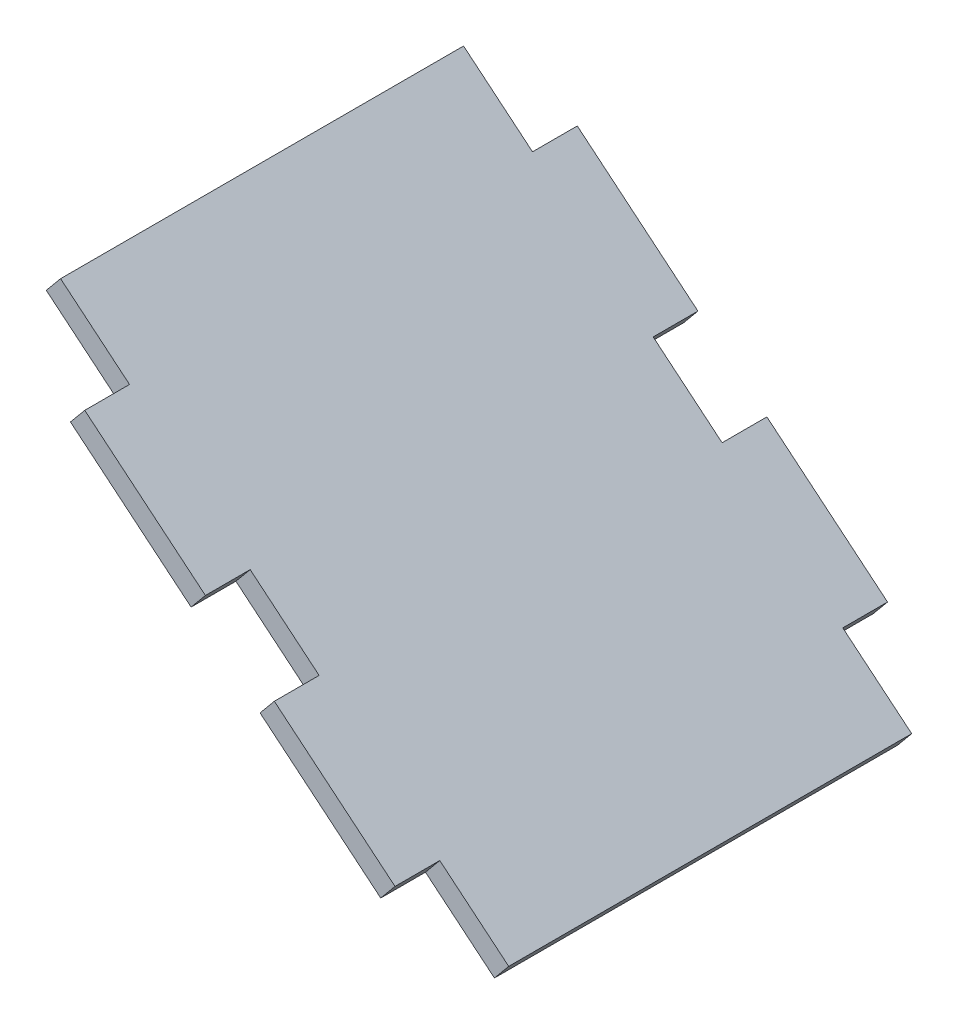
ISO-10303-21;
HEADER;
FILE_DESCRIPTION(('STEP AP214'),'2;1');
FILE_NAME('part.step','',(''),(''),'','','');
FILE_SCHEMA(('AUTOMOTIVE_DESIGN { 1 0 10303 214 1 1 1 1 }'));
ENDSEC;
DATA;
#1=APPLICATION_CONTEXT('core data for automotive mechanical design processes');
#2=APPLICATION_PROTOCOL_DEFINITION('international standard','automotive_design',2000,#1);
#3=PRODUCT_CONTEXT('',#1,'mechanical');
#4=PRODUCT('Part','Part','',(#3));
#5=PRODUCT_RELATED_PRODUCT_CATEGORY('part','',(#4));
#6=PRODUCT_DEFINITION_FORMATION('','',#4);
#7=PRODUCT_DEFINITION_CONTEXT('part definition',#1,'design');
#8=PRODUCT_DEFINITION('design','',#6,#7);
#9=PRODUCT_DEFINITION_SHAPE('','',#8);
#10=(LENGTH_UNIT() NAMED_UNIT(*) SI_UNIT(.MILLI.,.METRE.));
#11=(NAMED_UNIT(*) PLANE_ANGLE_UNIT() SI_UNIT($,.RADIAN.));
#12=(NAMED_UNIT(*) SI_UNIT($,.STERADIAN.) SOLID_ANGLE_UNIT());
#13=UNCERTAINTY_MEASURE_WITH_UNIT(LENGTH_MEASURE(1.E-05),#10,'distance_accuracy_value','');
#14=(GEOMETRIC_REPRESENTATION_CONTEXT(3) GLOBAL_UNCERTAINTY_ASSIGNED_CONTEXT((#13)) GLOBAL_UNIT_ASSIGNED_CONTEXT((#10,
#11,#12)) REPRESENTATION_CONTEXT('',''));
#15=CARTESIAN_POINT('',(0.,0.,0.));
#16=DIRECTION('',(0.,0.,1.));
#17=DIRECTION('',(1.,0.,0.));
#18=AXIS2_PLACEMENT_3D('',#15,#16,#17);
#19=CARTESIAN_POINT('',(0.,0.,0.));
#20=DIRECTION('',(0.,0.,-1.));
#21=DIRECTION('',(-1.,0.,0.));
#22=AXIS2_PLACEMENT_3D('',#19,#20,#21);
#23=PLANE('',#22);
#24=DIRECTION('',(-0.769880780139359,0.638187734426174,0.));
#25=VECTOR('',#24,1.);
#26=CARTESIAN_POINT('',(503.990679128416,281.590154943298,0.));
#27=LINE('',#26,#25);
#28=CARTESIAN_POINT('',(467.325106974279,311.983845795345,0.));
#29=VERTEX_POINT('',#28);
#30=CARTESIAN_POINT('',(450.214506635682,326.167568192966,0.));
#31=VERTEX_POINT('',#30);
#32=EDGE_CURVE('E247',#29,#31,#27,.T.);
#33=ORIENTED_EDGE('',*,*,#32,.F.);
#34=DIRECTION('',(0.638187734426175,0.769880780139357,0.));
#35=VECTOR('',#34,1.);
#36=CARTESIAN_POINT('',(123.704716452548,-102.544231220312,0.));
#37=LINE('',#36,#35);
#38=CARTESIAN_POINT('',(469.351353031082,314.428217272287,0.));
#39=VERTEX_POINT('',#38);
#40=EDGE_CURVE('E230',#29,#39,#37,.T.);
#41=ORIENTED_EDGE('',*,*,#40,.T.);
#42=DIRECTION('',(0.769880780139357,-0.638187734426175,0.));
#43=VECTOR('',#42,1.);
#44=CARTESIAN_POINT('',(442.463266784715,336.716923897121,0.));
#45=LINE('',#44,#43);
#46=CARTESIAN_POINT('',(452.240752692485,328.611939669909,0.));
#47=VERTEX_POINT('',#46);
#48=EDGE_CURVE('E243',#47,#39,#45,.T.);
#49=ORIENTED_EDGE('',*,*,#48,.F.);
#50=DIRECTION('',(-0.638187734426175,-0.769880780139357,0.));
#51=VECTOR('',#50,1.);
#52=CARTESIAN_POINT('',(106.594116113951,-88.3605088226899,0.));
#53=LINE('',#52,#51);
#54=EDGE_CURVE('E221',#47,#31,#53,.T.);
#55=ORIENTED_EDGE('',*,*,#54,.T.);
#56=EDGE_LOOP('',(#33,#41,#49,#55));
#57=FACE_BOUND('',#56,.T.);
#58=ADVANCED_FACE('F33',(#57),#23,.F.);
#59=CARTESIAN_POINT('',(0.,0.,-69.85));
#60=DIRECTION('',(0.,0.,-1.));
#61=DIRECTION('',(-1.,0.,0.));
#62=AXIS2_PLACEMENT_3D('',#59,#60,#61);
#63=PLANE('',#62);
#64=DIRECTION('',(0.638187734426175,0.769880780139357,0.));
#65=VECTOR('',#64,1.);
#66=CARTESIAN_POINT('',(123.704716452548,-102.544231220312,-69.85));
#67=LINE('',#66,#65);
#68=CARTESIAN_POINT('',(467.325106974279,311.983845795345,-69.85));
#69=VERTEX_POINT('',#68);
#70=CARTESIAN_POINT('',(469.351353031082,314.428217272287,-69.85));
#71=VERTEX_POINT('',#70);
#72=EDGE_CURVE('E211',#69,#71,#67,.T.);
#73=ORIENTED_EDGE('',*,*,#72,.F.);
#74=DIRECTION('',(-0.769880780139359,0.638187734426174,0.));
#75=VECTOR('',#74,1.);
#76=CARTESIAN_POINT('',(503.990679128416,281.590154943298,-69.85));
#77=LINE('',#76,#75);
#78=CARTESIAN_POINT('',(450.214506635682,326.167568192966,-69.85));
#79=VERTEX_POINT('',#78);
#80=EDGE_CURVE('E261',#69,#79,#77,.T.);
#81=ORIENTED_EDGE('',*,*,#80,.T.);
#82=DIRECTION('',(-0.638187734426175,-0.769880780139357,0.));
#83=VECTOR('',#82,1.);
#84=CARTESIAN_POINT('',(106.594116113951,-88.3605088226899,-69.85));
#85=LINE('',#84,#83);
#86=CARTESIAN_POINT('',(452.240752692485,328.611939669909,-69.85));
#87=VERTEX_POINT('',#86);
#88=EDGE_CURVE('E197',#87,#79,#85,.T.);
#89=ORIENTED_EDGE('',*,*,#88,.F.);
#90=DIRECTION('',(0.769880780139357,-0.638187734426175,0.));
#91=VECTOR('',#90,1.);
#92=CARTESIAN_POINT('',(442.463266784715,336.716923897121,-69.85));
#93=LINE('',#92,#91);
#94=EDGE_CURVE('E266',#87,#71,#93,.T.);
#95=ORIENTED_EDGE('',*,*,#94,.T.);
#96=EDGE_LOOP('',(#73,#81,#89,#95));
#97=FACE_BOUND('',#96,.T.);
#98=ADVANCED_FACE('F369',(#97),#63,.T.);
#99=CARTESIAN_POINT('',(440.437020727912,334.272552420179,-69.85));
#100=DIRECTION('',(0.769880780139358,-0.638187734426175,0.));
#101=DIRECTION('',(0.638187734426175,0.769880780139358,0.));
#102=AXIS2_PLACEMENT_3D('',#99,#100,#101);
#103=PLANE('',#102);
#104=DIRECTION('',(0.,0.,1.));
#105=VECTOR('',#104,1.);
#106=CARTESIAN_POINT('',(440.437020727912,334.272552420179,-69.85));
#107=LINE('',#106,#105);
#108=CARTESIAN_POINT('',(440.437020727912,334.272552420179,-63.5));
#109=VERTEX_POINT('',#108);
#110=CARTESIAN_POINT('',(440.437020727912,334.272552420179,-6.35000000000002));
#111=VERTEX_POINT('',#110);
#112=EDGE_CURVE('E199',#109,#111,#107,.T.);
#113=ORIENTED_EDGE('',*,*,#112,.T.);
#114=DIRECTION('',(0.638187734426175,0.769880780139357,0.));
#115=VECTOR('',#114,1.);
#116=CARTESIAN_POINT('',(414.5526589346,303.046830620993,-6.35000000000002));
#117=LINE('',#116,#115);
#118=CARTESIAN_POINT('',(442.463266784715,336.716923897122,-6.35000000000002));
#119=VERTEX_POINT('',#118);
#120=EDGE_CURVE('E315',#111,#119,#117,.T.);
#121=ORIENTED_EDGE('',*,*,#120,.T.);
#122=DIRECTION('',(0.,0.,1.));
#123=VECTOR('',#122,1.);
#124=CARTESIAN_POINT('',(442.463266784715,336.716923897121,-69.85));
#125=LINE('',#124,#123);
#126=CARTESIAN_POINT('',(442.463266784715,336.716923897122,-63.5));
#127=VERTEX_POINT('',#126);
#128=EDGE_CURVE('E193',#127,#119,#125,.T.);
#129=ORIENTED_EDGE('',*,*,#128,.F.);
#130=DIRECTION('',(0.638187734426175,0.769880780139357,0.));
#131=VECTOR('',#130,1.);
#132=CARTESIAN_POINT('',(414.5526589346,303.046830620993,-63.5));
#133=LINE('',#132,#131);
#134=EDGE_CURVE('E275',#109,#127,#133,.T.);
#135=ORIENTED_EDGE('',*,*,#134,.F.);
#136=EDGE_LOOP('',(#113,#121,#129,#135));
#137=FACE_BOUND('',#136,.T.);
#138=ADVANCED_FACE('F35',(#137),#103,.F.);
#139=CARTESIAN_POINT('',(442.463266784715,336.716923897121,-69.85));
#140=DIRECTION('',(-0.638187734426175,-0.769880780139357,0.));
#141=DIRECTION('',(0.769880780139357,-0.638187734426175,0.));
#142=AXIS2_PLACEMENT_3D('',#139,#140,#141);
#143=PLANE('',#142);
#144=CARTESIAN_POINT('',(479.128838938852,306.323233045075,0.));
#145=VERTEX_POINT('',#144);
#146=CARTESIAN_POINT('',(496.239439277449,292.139510647453,0.));
#147=VERTEX_POINT('',#146);
#148=EDGE_CURVE('E238',#145,#147,#45,.T.);
#149=ORIENTED_EDGE('',*,*,#148,.T.);
#150=DIRECTION('',(0.,0.,1.));
#151=VECTOR('',#150,1.);
#152=CARTESIAN_POINT('',(496.239439277449,292.139510647453,0.));
#153=LINE('',#152,#151);
#154=CARTESIAN_POINT('',(496.239439277449,292.139510647453,-6.35000000000002));
#155=VERTEX_POINT('',#154);
#156=EDGE_CURVE('E48',#155,#147,#153,.T.);
#157=ORIENTED_EDGE('',*,*,#156,.F.);
#158=DIRECTION('',(-0.769880780139358,0.638187734426174,0.));
#159=VECTOR('',#158,1.);
#160=CARTESIAN_POINT('',(506.016925185219,284.034526420241,-6.35000000000002));
#161=LINE('',#160,#159);
#162=CARTESIAN_POINT('',(506.016925185219,284.034526420241,-6.35000000000002));
#163=VERTEX_POINT('',#162);
#164=EDGE_CURVE('E176',#163,#155,#161,.T.);
#165=ORIENTED_EDGE('',*,*,#164,.F.);
#166=DIRECTION('',(0.,0.,1.));
#167=VECTOR('',#166,1.);
#168=CARTESIAN_POINT('',(506.016925185219,284.03452642024,-69.85));
#169=LINE('',#168,#167);
#170=CARTESIAN_POINT('',(506.016925185219,284.034526420241,-63.5));
#171=VERTEX_POINT('',#170);
#172=EDGE_CURVE('E188',#171,#163,#169,.T.);
#173=ORIENTED_EDGE('',*,*,#172,.F.);
#174=DIRECTION('',(0.769880780139358,-0.638187734426174,0.));
#175=VECTOR('',#174,1.);
#176=CARTESIAN_POINT('',(506.016925185219,284.034526420241,-63.5));
#177=LINE('',#176,#175);
#178=CARTESIAN_POINT('',(496.239439277449,292.139510647453,-63.5));
#179=VERTEX_POINT('',#178);
#180=EDGE_CURVE('E306',#179,#171,#177,.T.);
#181=ORIENTED_EDGE('',*,*,#180,.F.);
#182=DIRECTION('',(0.,0.,1.));
#183=VECTOR('',#182,1.);
#184=CARTESIAN_POINT('',(496.239439277449,292.139510647453,-69.85));
#185=LINE('',#184,#183);
#186=CARTESIAN_POINT('',(496.239439277449,292.139510647453,-69.85));
#187=VERTEX_POINT('',#186);
#188=EDGE_CURVE('E309',#187,#179,#185,.T.);
#189=ORIENTED_EDGE('',*,*,#188,.F.);
#190=CARTESIAN_POINT('',(479.128838938852,306.323233045075,-69.85));
#191=VERTEX_POINT('',#190);
#192=EDGE_CURVE('E255',#191,#187,#93,.T.);
#193=ORIENTED_EDGE('',*,*,#192,.F.);
#194=DIRECTION('',(0.,0.,-1.));
#195=VECTOR('',#194,1.);
#196=CARTESIAN_POINT('',(479.128838938852,306.323233045075,-69.85));
#197=LINE('',#196,#195);
#198=CARTESIAN_POINT('',(479.128838938852,306.323233045075,-63.5));
#199=VERTEX_POINT('',#198);
#200=EDGE_CURVE('E292',#199,#191,#197,.T.);
#201=ORIENTED_EDGE('',*,*,#200,.F.);
#202=DIRECTION('',(0.769880780139356,-0.638187734426177,0.));
#203=VECTOR('',#202,1.);
#204=CARTESIAN_POINT('',(469.351353031082,314.428217272287,-63.5));
#205=LINE('',#204,#203);
#206=CARTESIAN_POINT('',(469.351353031082,314.428217272287,-63.5));
#207=VERTEX_POINT('',#206);
#208=EDGE_CURVE('E295',#207,#199,#205,.T.);
#209=ORIENTED_EDGE('',*,*,#208,.F.);
#210=DIRECTION('',(0.,0.,1.));
#211=VECTOR('',#210,1.);
#212=CARTESIAN_POINT('',(469.351353031082,314.428217272287,-69.85));
#213=LINE('',#212,#211);
#214=EDGE_CURVE('E298',#71,#207,#213,.T.);
#215=ORIENTED_EDGE('',*,*,#214,.F.);
#216=ORIENTED_EDGE('',*,*,#94,.F.);
#217=DIRECTION('',(0.,0.,-1.));
#218=VECTOR('',#217,1.);
#219=CARTESIAN_POINT('',(452.240752692485,328.611939669909,-69.85));
#220=LINE('',#219,#218);
#221=CARTESIAN_POINT('',(452.240752692485,328.611939669909,-63.5));
#222=VERTEX_POINT('',#221);
#223=EDGE_CURVE('E277',#222,#87,#220,.T.);
#224=ORIENTED_EDGE('',*,*,#223,.F.);
#225=DIRECTION('',(0.769880780139356,-0.638187734426177,0.));
#226=VECTOR('',#225,1.);
#227=CARTESIAN_POINT('',(442.463266784715,336.716923897122,-63.5));
#228=LINE('',#227,#226);
#229=EDGE_CURVE('E280',#127,#222,#228,.T.);
#230=ORIENTED_EDGE('',*,*,#229,.F.);
#231=ORIENTED_EDGE('',*,*,#128,.T.);
#232=DIRECTION('',(-0.769880780139356,0.638187734426177,0.));
#233=VECTOR('',#232,1.);
#234=CARTESIAN_POINT('',(442.463266784715,336.716923897122,-6.35000000000002));
#235=LINE('',#234,#233);
#236=CARTESIAN_POINT('',(452.240752692485,328.611939669909,-6.35000000000002));
#237=VERTEX_POINT('',#236);
#238=EDGE_CURVE('E318',#237,#119,#235,.T.);
#239=ORIENTED_EDGE('',*,*,#238,.F.);
#240=DIRECTION('',(0.,0.,-1.));
#241=VECTOR('',#240,1.);
#242=CARTESIAN_POINT('',(452.240752692485,328.611939669909,0.));
#243=LINE('',#242,#241);
#244=EDGE_CURVE('E321',#47,#237,#243,.T.);
#245=ORIENTED_EDGE('',*,*,#244,.F.);
#246=ORIENTED_EDGE('',*,*,#48,.T.);
#247=DIRECTION('',(0.,0.,1.));
#248=VECTOR('',#247,1.);
#249=CARTESIAN_POINT('',(469.351353031082,314.428217272287,0.));
#250=LINE('',#249,#248);
#251=CARTESIAN_POINT('',(469.351353031082,314.428217272287,-6.35000000000002));
#252=VERTEX_POINT('',#251);
#253=EDGE_CURVE('E337',#252,#39,#250,.T.);
#254=ORIENTED_EDGE('',*,*,#253,.F.);
#255=DIRECTION('',(-0.769880780139356,0.638187734426177,0.));
#256=VECTOR('',#255,1.);
#257=CARTESIAN_POINT('',(469.351353031082,314.428217272287,-6.35000000000002));
#258=LINE('',#257,#256);
#259=CARTESIAN_POINT('',(479.128838938852,306.323233045075,-6.35000000000002));
#260=VERTEX_POINT('',#259);
#261=EDGE_CURVE('E332',#260,#252,#258,.T.);
#262=ORIENTED_EDGE('',*,*,#261,.F.);
#263=DIRECTION('',(0.,0.,-1.));
#264=VECTOR('',#263,1.);
#265=CARTESIAN_POINT('',(479.128838938852,306.323233045075,0.));
#266=LINE('',#265,#264);
#267=EDGE_CURVE('E242',#145,#260,#266,.T.);
#268=ORIENTED_EDGE('',*,*,#267,.F.);
#269=EDGE_LOOP('',(#149,#157,#165,#173,#181,#189,#193,#201,#209,#215,#216,#224,#230,#231,#239,
#245,#246,#254,#262,#268));
#270=FACE_BOUND('',#269,.T.);
#271=ADVANCED_FACE('F186',(#270),#143,.F.);
#272=CARTESIAN_POINT('',(506.016925185219,284.03452642024,-69.85));
#273=DIRECTION('',(-0.769880780139361,0.638187734426171,0.));
#274=DIRECTION('',(-0.638187734426171,-0.769880780139361,0.));
#275=AXIS2_PLACEMENT_3D('',#272,#273,#274);
#276=PLANE('',#275);
#277=ORIENTED_EDGE('',*,*,#172,.T.);
#278=DIRECTION('',(0.638187734426175,0.769880780139357,0.));
#279=VECTOR('',#278,1.);
#280=CARTESIAN_POINT('',(478.106317335104,250.364433144112,-6.35000000000002));
#281=LINE('',#280,#279);
#282=CARTESIAN_POINT('',(503.990679128416,281.590154943298,-6.35000000000002));
#283=VERTEX_POINT('',#282);
#284=EDGE_CURVE('E172',#283,#163,#281,.T.);
#285=ORIENTED_EDGE('',*,*,#284,.F.);
#286=DIRECTION('',(0.,0.,1.));
#287=VECTOR('',#286,1.);
#288=CARTESIAN_POINT('',(503.990679128416,281.590154943298,-69.85));
#289=LINE('',#288,#287);
#290=CARTESIAN_POINT('',(503.990679128416,281.590154943298,-63.5));
#291=VERTEX_POINT('',#290);
#292=EDGE_CURVE('E194',#291,#283,#289,.T.);
#293=ORIENTED_EDGE('',*,*,#292,.F.);
#294=DIRECTION('',(0.638187734426175,0.769880780139357,0.));
#295=VECTOR('',#294,1.);
#296=CARTESIAN_POINT('',(478.106317335104,250.364433144112,-63.5));
#297=LINE('',#296,#295);
#298=EDGE_CURVE('E192',#291,#171,#297,.T.);
#299=ORIENTED_EDGE('',*,*,#298,.T.);
#300=EDGE_LOOP('',(#277,#285,#293,#299));
#301=FACE_BOUND('',#300,.T.);
#302=ADVANCED_FACE('F191',(#301),#276,.F.);
#303=CARTESIAN_POINT('',(503.990679128416,281.590154943298,-69.85));
#304=DIRECTION('',(0.638187734426174,0.769880780139359,0.));
#305=DIRECTION('',(-0.769880780139359,0.638187734426174,0.));
#306=AXIS2_PLACEMENT_3D('',#303,#304,#305);
#307=PLANE('',#306);
#308=DIRECTION('',(-0.769880780139359,0.638187734426174,0.));
#309=VECTOR('',#308,1.);
#310=CARTESIAN_POINT('',(503.990679128416,281.590154943298,-6.35000000000002));
#311=LINE('',#310,#309);
#312=CARTESIAN_POINT('',(494.213193220646,289.695139170511,-6.35000000000002));
#313=VERTEX_POINT('',#312);
#314=EDGE_CURVE('E11',#283,#313,#311,.T.);
#315=ORIENTED_EDGE('',*,*,#314,.T.);
#316=DIRECTION('',(0.,0.,1.));
#317=VECTOR('',#316,1.);
#318=CARTESIAN_POINT('',(494.213193220646,289.695139170511,-69.85));
#319=LINE('',#318,#317);
#320=CARTESIAN_POINT('',(494.213193220646,289.695139170511,0.));
#321=VERTEX_POINT('',#320);
#322=EDGE_CURVE('E339',#313,#321,#319,.T.);
#323=ORIENTED_EDGE('',*,*,#322,.T.);
#324=CARTESIAN_POINT('',(477.102592882049,303.878861568132,0.));
#325=VERTEX_POINT('',#324);
#326=EDGE_CURVE('E56',#321,#325,#27,.T.);
#327=ORIENTED_EDGE('',*,*,#326,.T.);
#328=DIRECTION('',(0.,0.,-1.));
#329=VECTOR('',#328,1.);
#330=CARTESIAN_POINT('',(477.102592882049,303.878861568132,-69.85));
#331=LINE('',#330,#329);
#332=CARTESIAN_POINT('',(477.102592882049,303.878861568132,-6.35000000000002));
#333=VERTEX_POINT('',#332);
#334=EDGE_CURVE('E327',#325,#333,#331,.T.);
#335=ORIENTED_EDGE('',*,*,#334,.T.);
#336=DIRECTION('',(-0.769880780139359,0.638187734426174,0.));
#337=VECTOR('',#336,1.);
#338=CARTESIAN_POINT('',(503.990679128416,281.590154943298,-6.35000000000002));
#339=LINE('',#338,#337);
#340=CARTESIAN_POINT('',(467.325106974279,311.983845795345,-6.35000000000002));
#341=VERTEX_POINT('',#340);
#342=EDGE_CURVE('E233',#333,#341,#339,.T.);
#343=ORIENTED_EDGE('',*,*,#342,.T.);
#344=DIRECTION('',(0.,0.,1.));
#345=VECTOR('',#344,1.);
#346=CARTESIAN_POINT('',(467.325106974279,311.983845795345,-69.85));
#347=LINE('',#346,#345);
#348=EDGE_CURVE('E324',#341,#29,#347,.T.);
#349=ORIENTED_EDGE('',*,*,#348,.T.);
#350=ORIENTED_EDGE('',*,*,#32,.T.);
#351=DIRECTION('',(0.,0.,-1.));
#352=VECTOR('',#351,1.);
#353=CARTESIAN_POINT('',(450.214506635682,326.167568192966,-69.85));
#354=LINE('',#353,#352);
#355=CARTESIAN_POINT('',(450.214506635682,326.167568192966,-6.35000000000002));
#356=VERTEX_POINT('',#355);
#357=EDGE_CURVE('E312',#31,#356,#354,.T.);
#358=ORIENTED_EDGE('',*,*,#357,.T.);
#359=DIRECTION('',(-0.769880780139359,0.638187734426174,0.));
#360=VECTOR('',#359,1.);
#361=CARTESIAN_POINT('',(503.990679128416,281.590154943298,-6.35000000000002));
#362=LINE('',#361,#360);
#363=EDGE_CURVE('E224',#356,#111,#362,.T.);
#364=ORIENTED_EDGE('',*,*,#363,.T.);
#365=ORIENTED_EDGE('',*,*,#112,.F.);
#366=DIRECTION('',(0.769880780139359,-0.638187734426174,0.));
#367=VECTOR('',#366,1.);
#368=CARTESIAN_POINT('',(503.990679128416,281.590154943298,-63.5));
#369=LINE('',#368,#367);
#370=CARTESIAN_POINT('',(450.214506635682,326.167568192966,-63.5));
#371=VERTEX_POINT('',#370);
#372=EDGE_CURVE('E205',#109,#371,#369,.T.);
#373=ORIENTED_EDGE('',*,*,#372,.T.);
#374=DIRECTION('',(0.,0.,-1.));
#375=VECTOR('',#374,1.);
#376=CARTESIAN_POINT('',(450.214506635682,326.167568192966,-69.85));
#377=LINE('',#376,#375);
#378=EDGE_CURVE('E244',#371,#79,#377,.T.);
#379=ORIENTED_EDGE('',*,*,#378,.T.);
#380=ORIENTED_EDGE('',*,*,#80,.F.);
#381=DIRECTION('',(0.,0.,1.));
#382=VECTOR('',#381,1.);
#383=CARTESIAN_POINT('',(467.325106974279,311.983845795345,-69.85));
#384=LINE('',#383,#382);
#385=CARTESIAN_POINT('',(467.325106974279,311.983845795345,-63.5));
#386=VERTEX_POINT('',#385);
#387=EDGE_CURVE('E283',#69,#386,#384,.T.);
#388=ORIENTED_EDGE('',*,*,#387,.T.);
#389=DIRECTION('',(0.769880780139359,-0.638187734426174,0.));
#390=VECTOR('',#389,1.);
#391=CARTESIAN_POINT('',(503.990679128416,281.590154943298,-63.5));
#392=LINE('',#391,#390);
#393=CARTESIAN_POINT('',(477.102592882049,303.878861568132,-63.5));
#394=VERTEX_POINT('',#393);
#395=EDGE_CURVE('E213',#386,#394,#392,.T.);
#396=ORIENTED_EDGE('',*,*,#395,.T.);
#397=DIRECTION('',(0.,0.,-1.));
#398=VECTOR('',#397,1.);
#399=CARTESIAN_POINT('',(477.102592882049,303.878861568132,-69.85));
#400=LINE('',#399,#398);
#401=CARTESIAN_POINT('',(477.102592882049,303.878861568132,-69.85));
#402=VERTEX_POINT('',#401);
#403=EDGE_CURVE('E286',#394,#402,#400,.T.);
#404=ORIENTED_EDGE('',*,*,#403,.T.);
#405=CARTESIAN_POINT('',(494.213193220646,289.695139170511,-69.85));
#406=VERTEX_POINT('',#405);
#407=EDGE_CURVE('E253',#406,#402,#77,.T.);
#408=ORIENTED_EDGE('',*,*,#407,.F.);
#409=DIRECTION('',(0.,0.,1.));
#410=VECTOR('',#409,1.);
#411=CARTESIAN_POINT('',(494.213193220646,289.695139170511,-69.85));
#412=LINE('',#411,#410);
#413=CARTESIAN_POINT('',(494.213193220646,289.695139170511,-63.5));
#414=VERTEX_POINT('',#413);
#415=EDGE_CURVE('E301',#406,#414,#412,.T.);
#416=ORIENTED_EDGE('',*,*,#415,.T.);
#417=DIRECTION('',(0.769880780139359,-0.638187734426174,0.));
#418=VECTOR('',#417,1.);
#419=CARTESIAN_POINT('',(503.990679128416,281.590154943298,-63.5));
#420=LINE('',#419,#418);
#421=EDGE_CURVE('E218',#414,#291,#420,.T.);
#422=ORIENTED_EDGE('',*,*,#421,.T.);
#423=ORIENTED_EDGE('',*,*,#292,.T.);
#424=EDGE_LOOP('',(#315,#323,#327,#335,#343,#349,#350,#358,#364,#365,#373,#379,#380,#388,#396,
#404,#408,#416,#422,#423));
#425=FACE_BOUND('',#424,.T.);
#426=ADVANCED_FACE('F343',(#425),#307,.F.);
#427=DIRECTION('',(0.638187734426175,0.769880780139357,0.));
#428=VECTOR('',#427,1.);
#429=CARTESIAN_POINT('',(150.592802698915,-124.832937845146,-69.85));
#430=LINE('',#429,#428);
#431=EDGE_CURVE('E216',#406,#187,#430,.T.);
#432=ORIENTED_EDGE('',*,*,#431,.F.);
#433=ORIENTED_EDGE('',*,*,#407,.T.);
#434=DIRECTION('',(-0.638187734426175,-0.769880780139357,0.));
#435=VECTOR('',#434,1.);
#436=CARTESIAN_POINT('',(133.482202360318,-110.649215447524,-69.85));
#437=LINE('',#436,#435);
#438=EDGE_CURVE('E208',#191,#402,#437,.T.);
#439=ORIENTED_EDGE('',*,*,#438,.F.);
#440=ORIENTED_EDGE('',*,*,#192,.T.);
#441=EDGE_LOOP('',(#432,#433,#439,#440));
#442=FACE_BOUND('',#441,.T.);
#443=ADVANCED_FACE('F352',(#442),#63,.T.);
#444=ORIENTED_EDGE('',*,*,#326,.F.);
#445=DIRECTION('',(0.638187734426175,0.769880780139357,0.));
#446=VECTOR('',#445,1.);
#447=CARTESIAN_POINT('',(150.592802698915,-124.832937845146,0.));
#448=LINE('',#447,#446);
#449=EDGE_CURVE('E41',#321,#147,#448,.T.);
#450=ORIENTED_EDGE('',*,*,#449,.T.);
#451=ORIENTED_EDGE('',*,*,#148,.F.);
#452=DIRECTION('',(-0.638187734426175,-0.769880780139357,0.));
#453=VECTOR('',#452,1.);
#454=CARTESIAN_POINT('',(133.482202360318,-110.649215447524,0.));
#455=LINE('',#454,#453);
#456=EDGE_CURVE('E227',#145,#325,#455,.T.);
#457=ORIENTED_EDGE('',*,*,#456,.T.);
#458=EDGE_LOOP('',(#444,#450,#451,#457));
#459=FACE_BOUND('',#458,.T.);
#460=ADVANCED_FACE('F237',(#459),#23,.F.);
#461=CARTESIAN_POINT('',(414.5526589346,303.046830620993,-63.5));
#462=DIRECTION('',(0.,0.,1.));
#463=DIRECTION('',(1.,0.,0.));
#464=AXIS2_PLACEMENT_3D('',#461,#462,#463);
#465=PLANE('',#464);
#466=ORIENTED_EDGE('',*,*,#134,.T.);
#467=ORIENTED_EDGE('',*,*,#229,.T.);
#468=DIRECTION('',(0.638187734426175,0.769880780139357,0.));
#469=VECTOR('',#468,1.);
#470=CARTESIAN_POINT('',(424.33014484237,294.941846393781,-63.5));
#471=LINE('',#470,#469);
#472=EDGE_CURVE('E249',#371,#222,#471,.T.);
#473=ORIENTED_EDGE('',*,*,#472,.F.);
#474=ORIENTED_EDGE('',*,*,#372,.F.);
#475=EDGE_LOOP('',(#466,#467,#473,#474));
#476=FACE_BOUND('',#475,.T.);
#477=ADVANCED_FACE('F384',(#476),#465,.F.);
#478=CARTESIAN_POINT('',(424.33014484237,294.941846393781,-69.85));
#479=DIRECTION('',(0.769880780139357,-0.638187734426175,0.));
#480=DIRECTION('',(0.638187734426175,0.769880780139357,0.));
#481=AXIS2_PLACEMENT_3D('',#478,#479,#480);
#482=PLANE('',#481);
#483=ORIENTED_EDGE('',*,*,#472,.T.);
#484=ORIENTED_EDGE('',*,*,#223,.T.);
#485=ORIENTED_EDGE('',*,*,#88,.T.);
#486=ORIENTED_EDGE('',*,*,#378,.F.);
#487=EDGE_LOOP('',(#483,#484,#485,#486));
#488=FACE_BOUND('',#487,.T.);
#489=ADVANCED_FACE('F367',(#488),#482,.F.);
#490=CARTESIAN_POINT('',(441.440745180967,280.758123996159,-63.5));
#491=DIRECTION('',(0.,0.,1.));
#492=DIRECTION('',(1.,0.,0.));
#493=AXIS2_PLACEMENT_3D('',#490,#491,#492);
#494=PLANE('',#493);
#495=DIRECTION('',(0.638187734426175,0.769880780139357,0.));
#496=VECTOR('',#495,1.);
#497=CARTESIAN_POINT('',(441.440745180967,280.758123996159,-63.5));
#498=LINE('',#497,#496);
#499=EDGE_CURVE('E290',#386,#207,#498,.T.);
#500=ORIENTED_EDGE('',*,*,#499,.T.);
#501=ORIENTED_EDGE('',*,*,#208,.T.);
#502=DIRECTION('',(0.638187734426175,0.769880780139357,0.));
#503=VECTOR('',#502,1.);
#504=CARTESIAN_POINT('',(451.218231088737,272.653139768947,-63.5));
#505=LINE('',#504,#503);
#506=EDGE_CURVE('E289',#394,#199,#505,.T.);
#507=ORIENTED_EDGE('',*,*,#506,.F.);
#508=ORIENTED_EDGE('',*,*,#395,.F.);
#509=EDGE_LOOP('',(#500,#501,#507,#508));
#510=FACE_BOUND('',#509,.T.);
#511=ADVANCED_FACE('F358',(#510),#494,.F.);
#512=CARTESIAN_POINT('',(441.440745180967,280.758123996159,-69.85));
#513=DIRECTION('',(-0.769880780139357,0.638187734426175,0.));
#514=DIRECTION('',(-0.638187734426175,-0.769880780139357,0.));
#515=AXIS2_PLACEMENT_3D('',#512,#513,#514);
#516=PLANE('',#515);
#517=ORIENTED_EDGE('',*,*,#72,.T.);
#518=ORIENTED_EDGE('',*,*,#214,.T.);
#519=ORIENTED_EDGE('',*,*,#499,.F.);
#520=ORIENTED_EDGE('',*,*,#387,.F.);
#521=EDGE_LOOP('',(#517,#518,#519,#520));
#522=FACE_BOUND('',#521,.T.);
#523=ADVANCED_FACE('F360',(#522),#516,.F.);
#524=CARTESIAN_POINT('',(451.218231088737,272.653139768947,-69.85));
#525=DIRECTION('',(0.769880780139357,-0.638187734426175,0.));
#526=DIRECTION('',(0.638187734426175,0.769880780139357,0.));
#527=AXIS2_PLACEMENT_3D('',#524,#525,#526);
#528=PLANE('',#527);
#529=ORIENTED_EDGE('',*,*,#506,.T.);
#530=ORIENTED_EDGE('',*,*,#200,.T.);
#531=ORIENTED_EDGE('',*,*,#438,.T.);
#532=ORIENTED_EDGE('',*,*,#403,.F.);
#533=EDGE_LOOP('',(#529,#530,#531,#532));
#534=FACE_BOUND('',#533,.T.);
#535=ADVANCED_FACE('F354',(#534),#528,.F.);
#536=CARTESIAN_POINT('',(478.106317335104,250.364433144112,-63.5));
#537=DIRECTION('',(0.,0.,1.));
#538=DIRECTION('',(1.,0.,0.));
#539=AXIS2_PLACEMENT_3D('',#536,#537,#538);
#540=PLANE('',#539);
#541=DIRECTION('',(0.638187734426175,0.769880780139357,0.));
#542=VECTOR('',#541,1.);
#543=CARTESIAN_POINT('',(468.328831427334,258.469417371325,-63.5));
#544=LINE('',#543,#542);
#545=EDGE_CURVE('E304',#414,#179,#544,.T.);
#546=ORIENTED_EDGE('',*,*,#545,.T.);
#547=ORIENTED_EDGE('',*,*,#180,.T.);
#548=ORIENTED_EDGE('',*,*,#298,.F.);
#549=ORIENTED_EDGE('',*,*,#421,.F.);
#550=EDGE_LOOP('',(#546,#547,#548,#549));
#551=FACE_BOUND('',#550,.T.);
#552=ADVANCED_FACE('F346',(#551),#540,.F.);
#553=CARTESIAN_POINT('',(468.328831427334,258.469417371325,-69.85));
#554=DIRECTION('',(-0.769880780139357,0.638187734426175,0.));
#555=DIRECTION('',(-0.638187734426175,-0.769880780139357,0.));
#556=AXIS2_PLACEMENT_3D('',#553,#554,#555);
#557=PLANE('',#556);
#558=ORIENTED_EDGE('',*,*,#431,.T.);
#559=ORIENTED_EDGE('',*,*,#188,.T.);
#560=ORIENTED_EDGE('',*,*,#545,.F.);
#561=ORIENTED_EDGE('',*,*,#415,.F.);
#562=EDGE_LOOP('',(#558,#559,#560,#561));
#563=FACE_BOUND('',#562,.T.);
#564=ADVANCED_FACE('F348',(#563),#557,.F.);
#565=CARTESIAN_POINT('',(414.5526589346,303.046830620993,-6.35000000000002));
#566=DIRECTION('',(0.,0.,-1.));
#567=DIRECTION('',(-1.,0.,0.));
#568=AXIS2_PLACEMENT_3D('',#565,#566,#567);
#569=PLANE('',#568);
#570=DIRECTION('',(0.638187734426175,0.769880780139357,0.));
#571=VECTOR('',#570,1.);
#572=CARTESIAN_POINT('',(424.33014484237,294.941846393781,-6.35000000000002));
#573=LINE('',#572,#571);
#574=EDGE_CURVE('E316',#356,#237,#573,.T.);
#575=ORIENTED_EDGE('',*,*,#574,.T.);
#576=ORIENTED_EDGE('',*,*,#238,.T.);
#577=ORIENTED_EDGE('',*,*,#120,.F.);
#578=ORIENTED_EDGE('',*,*,#363,.F.);
#579=EDGE_LOOP('',(#575,#576,#577,#578));
#580=FACE_BOUND('',#579,.T.);
#581=ADVANCED_FACE('F472',(#580),#569,.F.);
#582=CARTESIAN_POINT('',(424.33014484237,294.941846393781,0.));
#583=DIRECTION('',(0.769880780139357,-0.638187734426175,0.));
#584=DIRECTION('',(0.638187734426175,0.769880780139357,0.));
#585=AXIS2_PLACEMENT_3D('',#582,#583,#584);
#586=PLANE('',#585);
#587=ORIENTED_EDGE('',*,*,#54,.F.);
#588=ORIENTED_EDGE('',*,*,#244,.T.);
#589=ORIENTED_EDGE('',*,*,#574,.F.);
#590=ORIENTED_EDGE('',*,*,#357,.F.);
#591=EDGE_LOOP('',(#587,#588,#589,#590));
#592=FACE_BOUND('',#591,.T.);
#593=ADVANCED_FACE('F481',(#592),#586,.F.);
#594=CARTESIAN_POINT('',(441.440745180967,280.758123996159,-6.35000000000002));
#595=DIRECTION('',(0.,0.,-1.));
#596=DIRECTION('',(-1.,0.,0.));
#597=AXIS2_PLACEMENT_3D('',#594,#595,#596);
#598=PLANE('',#597);
#599=DIRECTION('',(0.638187734426175,0.769880780139357,0.));
#600=VECTOR('',#599,1.);
#601=CARTESIAN_POINT('',(451.218231088737,272.653139768947,-6.35000000000002));
#602=LINE('',#601,#600);
#603=EDGE_CURVE('E330',#333,#260,#602,.T.);
#604=ORIENTED_EDGE('',*,*,#603,.T.);
#605=ORIENTED_EDGE('',*,*,#261,.T.);
#606=DIRECTION('',(0.638187734426175,0.769880780139357,0.));
#607=VECTOR('',#606,1.);
#608=CARTESIAN_POINT('',(441.440745180967,280.758123996159,-6.35000000000002));
#609=LINE('',#608,#607);
#610=EDGE_CURVE('E329',#341,#252,#609,.T.);
#611=ORIENTED_EDGE('',*,*,#610,.F.);
#612=ORIENTED_EDGE('',*,*,#342,.F.);
#613=EDGE_LOOP('',(#604,#605,#611,#612));
#614=FACE_BOUND('',#613,.T.);
#615=ADVANCED_FACE('F491',(#614),#598,.F.);
#616=CARTESIAN_POINT('',(441.440745180967,280.758123996159,0.));
#617=DIRECTION('',(-0.769880780139357,0.638187734426175,0.));
#618=DIRECTION('',(-0.638187734426175,-0.769880780139357,0.));
#619=AXIS2_PLACEMENT_3D('',#616,#617,#618);
#620=PLANE('',#619);
#621=ORIENTED_EDGE('',*,*,#610,.T.);
#622=ORIENTED_EDGE('',*,*,#253,.T.);
#623=ORIENTED_EDGE('',*,*,#40,.F.);
#624=ORIENTED_EDGE('',*,*,#348,.F.);
#625=EDGE_LOOP('',(#621,#622,#623,#624));
#626=FACE_BOUND('',#625,.T.);
#627=ADVANCED_FACE('F501',(#626),#620,.F.);
#628=CARTESIAN_POINT('',(451.218231088737,272.653139768947,0.));
#629=DIRECTION('',(0.769880780139357,-0.638187734426175,0.));
#630=DIRECTION('',(0.638187734426175,0.769880780139357,0.));
#631=AXIS2_PLACEMENT_3D('',#628,#629,#630);
#632=PLANE('',#631);
#633=ORIENTED_EDGE('',*,*,#456,.F.);
#634=ORIENTED_EDGE('',*,*,#267,.T.);
#635=ORIENTED_EDGE('',*,*,#603,.F.);
#636=ORIENTED_EDGE('',*,*,#334,.F.);
#637=EDGE_LOOP('',(#633,#634,#635,#636));
#638=FACE_BOUND('',#637,.T.);
#639=ADVANCED_FACE('F511',(#638),#632,.F.);
#640=CARTESIAN_POINT('',(478.106317335104,250.364433144112,-6.35000000000002));
#641=DIRECTION('',(0.,0.,-1.));
#642=DIRECTION('',(-1.,0.,0.));
#643=AXIS2_PLACEMENT_3D('',#640,#641,#642);
#644=PLANE('',#643);
#645=ORIENTED_EDGE('',*,*,#284,.T.);
#646=ORIENTED_EDGE('',*,*,#164,.T.);
#647=DIRECTION('',(0.638187734426175,0.769880780139357,0.));
#648=VECTOR('',#647,1.);
#649=CARTESIAN_POINT('',(468.328831427334,258.469417371325,-6.35000000000002));
#650=LINE('',#649,#648);
#651=EDGE_CURVE('E181',#313,#155,#650,.T.);
#652=ORIENTED_EDGE('',*,*,#651,.F.);
#653=ORIENTED_EDGE('',*,*,#314,.F.);
#654=EDGE_LOOP('',(#645,#646,#652,#653));
#655=FACE_BOUND('',#654,.T.);
#656=ADVANCED_FACE('F174',(#655),#644,.F.);
#657=CARTESIAN_POINT('',(468.328831427334,258.469417371325,0.));
#658=DIRECTION('',(-0.769880780139357,0.638187734426175,0.));
#659=DIRECTION('',(-0.638187734426175,-0.769880780139357,0.));
#660=AXIS2_PLACEMENT_3D('',#657,#658,#659);
#661=PLANE('',#660);
#662=ORIENTED_EDGE('',*,*,#651,.T.);
#663=ORIENTED_EDGE('',*,*,#156,.T.);
#664=ORIENTED_EDGE('',*,*,#449,.F.);
#665=ORIENTED_EDGE('',*,*,#322,.F.);
#666=EDGE_LOOP('',(#662,#663,#664,#665));
#667=FACE_BOUND('',#666,.T.);
#668=ADVANCED_FACE('F342',(#667),#661,.F.);
#669=CLOSED_SHELL('',(#58,#98,#138,#271,#302,#426,#443,#460,#477,#489,#511,#523,#535,#552,#564,
#581,#593,#615,#627,#639,#656,#668));
#670=MANIFOLD_SOLID_BREP('B2',#669);
#671=ADVANCED_BREP_SHAPE_REPRESENTATION('',(#18,#670),#14);
#672=SHAPE_DEFINITION_REPRESENTATION(#9,#671);
ENDSEC;
END-ISO-10303-21;
